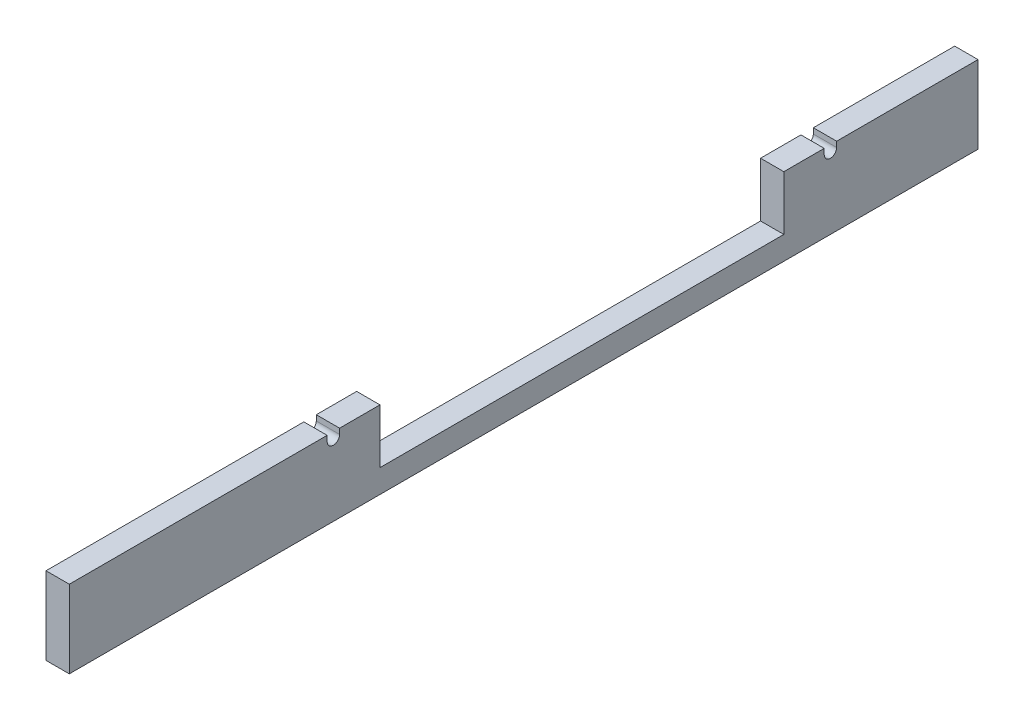
ISO-10303-21;
HEADER;
FILE_DESCRIPTION(('STEP AP214'),'2;1');
FILE_NAME('part.step','',(''),(''),'','','');
FILE_SCHEMA(('AUTOMOTIVE_DESIGN { 1 0 10303 214 1 1 1 1 }'));
ENDSEC;
DATA;
#1=APPLICATION_CONTEXT('core data for automotive mechanical design processes');
#2=APPLICATION_PROTOCOL_DEFINITION('international standard','automotive_design',2000,#1);
#3=PRODUCT_CONTEXT('',#1,'mechanical');
#4=PRODUCT('Part','Part','',(#3));
#5=PRODUCT_RELATED_PRODUCT_CATEGORY('part','',(#4));
#6=PRODUCT_DEFINITION_FORMATION('','',#4);
#7=PRODUCT_DEFINITION_CONTEXT('part definition',#1,'design');
#8=PRODUCT_DEFINITION('design','',#6,#7);
#9=PRODUCT_DEFINITION_SHAPE('','',#8);
#10=(LENGTH_UNIT() NAMED_UNIT(*) SI_UNIT(.MILLI.,.METRE.));
#11=(NAMED_UNIT(*) PLANE_ANGLE_UNIT() SI_UNIT($,.RADIAN.));
#12=(NAMED_UNIT(*) SI_UNIT($,.STERADIAN.) SOLID_ANGLE_UNIT());
#13=UNCERTAINTY_MEASURE_WITH_UNIT(LENGTH_MEASURE(1.E-05),#10,'distance_accuracy_value','');
#14=(GEOMETRIC_REPRESENTATION_CONTEXT(3) GLOBAL_UNCERTAINTY_ASSIGNED_CONTEXT((#13)) GLOBAL_UNIT_ASSIGNED_CONTEXT((#10,
#11,#12)) REPRESENTATION_CONTEXT('',''));
#15=CARTESIAN_POINT('',(0.,0.,0.));
#16=DIRECTION('',(0.,0.,1.));
#17=DIRECTION('',(1.,0.,0.));
#18=AXIS2_PLACEMENT_3D('',#15,#16,#17);
#19=CARTESIAN_POINT('',(15.,50.,0.));
#20=DIRECTION('',(0.,0.,-1.));
#21=DIRECTION('',(0.,1.,0.));
#22=AXIS2_PLACEMENT_3D('',#19,#20,#21);
#23=PLANE('',#22);
#24=DIRECTION('',(0.,-1.,0.));
#25=VECTOR('',#24,1.);
#26=CARTESIAN_POINT('',(0.,50.,0.));
#27=LINE('',#26,#25);
#28=CARTESIAN_POINT('',(0.,50.,0.));
#29=VERTEX_POINT('',#28);
#30=CARTESIAN_POINT('',(0.,0.,0.));
#31=VERTEX_POINT('',#30);
#32=EDGE_CURVE('E176',#29,#31,#27,.T.);
#33=ORIENTED_EDGE('',*,*,#32,.T.);
#34=DIRECTION('',(-1.,0.,0.));
#35=VECTOR('',#34,1.);
#36=CARTESIAN_POINT('',(15.,0.,0.));
#37=LINE('',#36,#35);
#38=CARTESIAN_POINT('',(15.,0.,0.));
#39=VERTEX_POINT('',#38);
#40=EDGE_CURVE('E11',#39,#31,#37,.T.);
#41=ORIENTED_EDGE('',*,*,#40,.F.);
#42=DIRECTION('',(0.,-1.,0.));
#43=VECTOR('',#42,1.);
#44=CARTESIAN_POINT('',(15.,50.,0.));
#45=LINE('',#44,#43);
#46=CARTESIAN_POINT('',(15.,50.,0.));
#47=VERTEX_POINT('',#46);
#48=EDGE_CURVE('E206',#47,#39,#45,.T.);
#49=ORIENTED_EDGE('',*,*,#48,.F.);
#50=DIRECTION('',(-1.,0.,0.));
#51=VECTOR('',#50,1.);
#52=CARTESIAN_POINT('',(15.,50.,0.));
#53=LINE('',#52,#51);
#54=EDGE_CURVE('E172',#47,#29,#53,.T.);
#55=ORIENTED_EDGE('',*,*,#54,.T.);
#56=EDGE_LOOP('',(#33,#41,#49,#55));
#57=FACE_BOUND('',#56,.T.);
#58=ADVANCED_FACE('F32',(#57),#23,.F.);
#59=CARTESIAN_POINT('',(15.,0.,0.));
#60=DIRECTION('',(0.,1.,0.));
#61=DIRECTION('',(0.,0.,1.));
#62=AXIS2_PLACEMENT_3D('',#59,#60,#61);
#63=PLANE('',#62);
#64=DIRECTION('',(0.,0.,-1.));
#65=VECTOR('',#64,1.);
#66=CARTESIAN_POINT('',(0.,0.,0.));
#67=LINE('',#66,#65);
#68=CARTESIAN_POINT('',(0.,0.,-585.));
#69=VERTEX_POINT('',#68);
#70=EDGE_CURVE('E179',#31,#69,#67,.T.);
#71=ORIENTED_EDGE('',*,*,#70,.T.);
#72=DIRECTION('',(-1.,0.,0.));
#73=VECTOR('',#72,1.);
#74=CARTESIAN_POINT('',(15.,0.,-585.));
#75=LINE('',#74,#73);
#76=CARTESIAN_POINT('',(15.,0.,-585.));
#77=VERTEX_POINT('',#76);
#78=EDGE_CURVE('E40',#77,#69,#75,.T.);
#79=ORIENTED_EDGE('',*,*,#78,.F.);
#80=DIRECTION('',(0.,0.,-1.));
#81=VECTOR('',#80,1.);
#82=CARTESIAN_POINT('',(15.,0.,0.));
#83=LINE('',#82,#81);
#84=EDGE_CURVE('E115',#39,#77,#83,.T.);
#85=ORIENTED_EDGE('',*,*,#84,.F.);
#86=ORIENTED_EDGE('',*,*,#40,.T.);
#87=EDGE_LOOP('',(#71,#79,#85,#86));
#88=FACE_BOUND('',#87,.T.);
#89=ADVANCED_FACE('F304',(#88),#63,.F.);
#90=CARTESIAN_POINT('',(15.,0.,-585.));
#91=DIRECTION('',(0.,0.,1.));
#92=DIRECTION('',(1.,0.,0.));
#93=AXIS2_PLACEMENT_3D('',#90,#91,#92);
#94=PLANE('',#93);
#95=DIRECTION('',(0.,1.,0.));
#96=VECTOR('',#95,1.);
#97=CARTESIAN_POINT('',(0.,0.,-585.));
#98=LINE('',#97,#96);
#99=CARTESIAN_POINT('',(0.,50.0000000000001,-585.));
#100=VERTEX_POINT('',#99);
#101=EDGE_CURVE('E181',#69,#100,#98,.T.);
#102=ORIENTED_EDGE('',*,*,#101,.T.);
#103=DIRECTION('',(-1.,0.,0.));
#104=VECTOR('',#103,1.);
#105=CARTESIAN_POINT('',(15.,50.0000000000001,-585.));
#106=LINE('',#105,#104);
#107=CARTESIAN_POINT('',(15.,50.0000000000001,-585.));
#108=VERTEX_POINT('',#107);
#109=EDGE_CURVE('E237',#108,#100,#106,.T.);
#110=ORIENTED_EDGE('',*,*,#109,.F.);
#111=DIRECTION('',(0.,1.,0.));
#112=VECTOR('',#111,1.);
#113=CARTESIAN_POINT('',(15.,0.,-585.));
#114=LINE('',#113,#112);
#115=EDGE_CURVE('E245',#77,#108,#114,.T.);
#116=ORIENTED_EDGE('',*,*,#115,.F.);
#117=ORIENTED_EDGE('',*,*,#78,.T.);
#118=EDGE_LOOP('',(#102,#110,#116,#117));
#119=FACE_BOUND('',#118,.T.);
#120=ADVANCED_FACE('F243',(#119),#94,.F.);
#121=CARTESIAN_POINT('',(15.,50.0000000000001,-585.));
#122=DIRECTION('',(0.,-1.,0.));
#123=DIRECTION('',(0.,0.,-1.));
#124=AXIS2_PLACEMENT_3D('',#121,#122,#123);
#125=PLANE('',#124);
#126=DIRECTION('',(0.,0.,1.));
#127=VECTOR('',#126,1.);
#128=CARTESIAN_POINT('',(0.,50.0000000000001,-585.));
#129=LINE('',#128,#127);
#130=CARTESIAN_POINT('',(0.,50.0000000000001,-494.));
#131=VERTEX_POINT('',#130);
#132=EDGE_CURVE('E183',#100,#131,#129,.T.);
#133=ORIENTED_EDGE('',*,*,#132,.T.);
#134=DIRECTION('',(-1.,0.,0.));
#135=VECTOR('',#134,1.);
#136=CARTESIAN_POINT('',(15.,50.0000000000001,-494.));
#137=LINE('',#136,#135);
#138=CARTESIAN_POINT('',(15.,50.0000000000001,-494.));
#139=VERTEX_POINT('',#138);
#140=EDGE_CURVE('E234',#139,#131,#137,.T.);
#141=ORIENTED_EDGE('',*,*,#140,.F.);
#142=DIRECTION('',(0.,0.,1.));
#143=VECTOR('',#142,1.);
#144=CARTESIAN_POINT('',(15.,50.0000000000001,-585.));
#145=LINE('',#144,#143);
#146=EDGE_CURVE('E263',#108,#139,#145,.T.);
#147=ORIENTED_EDGE('',*,*,#146,.F.);
#148=ORIENTED_EDGE('',*,*,#109,.T.);
#149=EDGE_LOOP('',(#133,#141,#147,#148));
#150=FACE_BOUND('',#149,.T.);
#151=ADVANCED_FACE('F254',(#150),#125,.F.);
#152=CARTESIAN_POINT('',(15.,46.5,-494.));
#153=DIRECTION('',(0.,0.,-1.));
#154=DIRECTION('',(-1.,0.,0.));
#155=AXIS2_PLACEMENT_3D('',#152,#153,#154);
#156=PLANE('',#155);
#157=DIRECTION('',(0.,-1.,0.));
#158=VECTOR('',#157,1.);
#159=CARTESIAN_POINT('',(0.,46.5,-494.));
#160=LINE('',#159,#158);
#161=CARTESIAN_POINT('',(0.,46.5,-494.));
#162=VERTEX_POINT('',#161);
#163=EDGE_CURVE('E185',#131,#162,#160,.T.);
#164=ORIENTED_EDGE('',*,*,#163,.T.);
#165=DIRECTION('',(-1.,0.,0.));
#166=VECTOR('',#165,1.);
#167=CARTESIAN_POINT('',(15.,46.5,-494.));
#168=LINE('',#167,#166);
#169=CARTESIAN_POINT('',(15.,46.5,-494.));
#170=VERTEX_POINT('',#169);
#171=EDGE_CURVE('E231',#170,#162,#168,.T.);
#172=ORIENTED_EDGE('',*,*,#171,.F.);
#173=DIRECTION('',(0.,-1.,0.));
#174=VECTOR('',#173,1.);
#175=CARTESIAN_POINT('',(15.,46.5,-494.));
#176=LINE('',#175,#174);
#177=EDGE_CURVE('E260',#139,#170,#176,.T.);
#178=ORIENTED_EDGE('',*,*,#177,.F.);
#179=ORIENTED_EDGE('',*,*,#140,.T.);
#180=EDGE_LOOP('',(#164,#172,#178,#179));
#181=FACE_BOUND('',#180,.T.);
#182=ADVANCED_FACE('F258',(#181),#156,.F.);
#183=CARTESIAN_POINT('',(15.,46.5,-490.));
#184=DIRECTION('',(-1.,0.,0.));
#185=DIRECTION('',(0.,0.,1.));
#186=AXIS2_PLACEMENT_3D('',#183,#184,#185);
#187=CYLINDRICAL_SURFACE('',#186,4.);
#188=CARTESIAN_POINT('',(0.,46.5,-490.));
#189=DIRECTION('',(-1.,0.,0.));
#190=DIRECTION('',(0.,0.,-1.));
#191=AXIS2_PLACEMENT_3D('',#188,#189,#190);
#192=CIRCLE('',#191,4.);
#193=CARTESIAN_POINT('',(0.,46.5,-486.));
#194=VERTEX_POINT('',#193);
#195=EDGE_CURVE('E187',#162,#194,#192,.T.);
#196=ORIENTED_EDGE('',*,*,#195,.T.);
#197=DIRECTION('',(-1.,0.,0.));
#198=VECTOR('',#197,1.);
#199=CARTESIAN_POINT('',(15.,46.5,-486.));
#200=LINE('',#199,#198);
#201=CARTESIAN_POINT('',(15.,46.5,-486.));
#202=VERTEX_POINT('',#201);
#203=EDGE_CURVE('E228',#202,#194,#200,.T.);
#204=ORIENTED_EDGE('',*,*,#203,.F.);
#205=CARTESIAN_POINT('',(15.,46.5,-490.));
#206=DIRECTION('',(-1.,0.,0.));
#207=DIRECTION('',(0.,0.,-1.));
#208=AXIS2_PLACEMENT_3D('',#205,#206,#207);
#209=CIRCLE('',#208,4.);
#210=EDGE_CURVE('E262',#170,#202,#209,.T.);
#211=ORIENTED_EDGE('',*,*,#210,.F.);
#212=ORIENTED_EDGE('',*,*,#171,.T.);
#213=EDGE_LOOP('',(#196,#204,#211,#212));
#214=FACE_BOUND('',#213,.T.);
#215=ADVANCED_FACE('F317',(#214),#187,.F.);
#216=CARTESIAN_POINT('',(15.,46.5,-486.));
#217=DIRECTION('',(0.,0.,1.));
#218=DIRECTION('',(1.,0.,0.));
#219=AXIS2_PLACEMENT_3D('',#216,#217,#218);
#220=PLANE('',#219);
#221=DIRECTION('',(0.,1.,0.));
#222=VECTOR('',#221,1.);
#223=CARTESIAN_POINT('',(0.,46.5,-486.));
#224=LINE('',#223,#222);
#225=CARTESIAN_POINT('',(0.,50.0000000000001,-486.));
#226=VERTEX_POINT('',#225);
#227=EDGE_CURVE('E189',#194,#226,#224,.T.);
#228=ORIENTED_EDGE('',*,*,#227,.T.);
#229=DIRECTION('',(-1.,0.,0.));
#230=VECTOR('',#229,1.);
#231=CARTESIAN_POINT('',(15.,50.0000000000001,-486.));
#232=LINE('',#231,#230);
#233=CARTESIAN_POINT('',(15.,50.0000000000001,-486.));
#234=VERTEX_POINT('',#233);
#235=EDGE_CURVE('E225',#234,#226,#232,.T.);
#236=ORIENTED_EDGE('',*,*,#235,.F.);
#237=DIRECTION('',(0.,1.,0.));
#238=VECTOR('',#237,1.);
#239=CARTESIAN_POINT('',(15.,46.5,-486.));
#240=LINE('',#239,#238);
#241=EDGE_CURVE('E265',#202,#234,#240,.T.);
#242=ORIENTED_EDGE('',*,*,#241,.F.);
#243=ORIENTED_EDGE('',*,*,#203,.T.);
#244=EDGE_LOOP('',(#228,#236,#242,#243));
#245=FACE_BOUND('',#244,.T.);
#246=ADVANCED_FACE('F320',(#245),#220,.F.);
#247=CARTESIAN_POINT('',(15.,50.0000000000001,-486.));
#248=DIRECTION('',(0.,-1.,0.));
#249=DIRECTION('',(0.,0.,-1.));
#250=AXIS2_PLACEMENT_3D('',#247,#248,#249);
#251=PLANE('',#250);
#252=DIRECTION('',(0.,0.,1.));
#253=VECTOR('',#252,1.);
#254=CARTESIAN_POINT('',(0.,50.0000000000001,-486.));
#255=LINE('',#254,#253);
#256=CARTESIAN_POINT('',(0.,50.0000000000001,-460.));
#257=VERTEX_POINT('',#256);
#258=EDGE_CURVE('E191',#226,#257,#255,.T.);
#259=ORIENTED_EDGE('',*,*,#258,.T.);
#260=DIRECTION('',(-1.,0.,0.));
#261=VECTOR('',#260,1.);
#262=CARTESIAN_POINT('',(15.,50.0000000000001,-460.));
#263=LINE('',#262,#261);
#264=CARTESIAN_POINT('',(15.,50.0000000000001,-460.));
#265=VERTEX_POINT('',#264);
#266=EDGE_CURVE('E222',#265,#257,#263,.T.);
#267=ORIENTED_EDGE('',*,*,#266,.F.);
#268=DIRECTION('',(0.,0.,1.));
#269=VECTOR('',#268,1.);
#270=CARTESIAN_POINT('',(15.,50.0000000000001,-486.));
#271=LINE('',#270,#269);
#272=EDGE_CURVE('E271',#234,#265,#271,.T.);
#273=ORIENTED_EDGE('',*,*,#272,.F.);
#274=ORIENTED_EDGE('',*,*,#235,.T.);
#275=EDGE_LOOP('',(#259,#267,#273,#274));
#276=FACE_BOUND('',#275,.T.);
#277=ADVANCED_FACE('F324',(#276),#251,.F.);
#278=CARTESIAN_POINT('',(15.,50.0000000000001,-460.));
#279=DIRECTION('',(0.,0.,-1.));
#280=DIRECTION('',(-1.,0.,0.));
#281=AXIS2_PLACEMENT_3D('',#278,#279,#280);
#282=PLANE('',#281);
#283=DIRECTION('',(0.,-1.,0.));
#284=VECTOR('',#283,1.);
#285=CARTESIAN_POINT('',(0.,50.0000000000001,-460.));
#286=LINE('',#285,#284);
#287=CARTESIAN_POINT('',(0.,15.,-460.));
#288=VERTEX_POINT('',#287);
#289=EDGE_CURVE('E193',#257,#288,#286,.T.);
#290=ORIENTED_EDGE('',*,*,#289,.T.);
#291=DIRECTION('',(-1.,0.,0.));
#292=VECTOR('',#291,1.);
#293=CARTESIAN_POINT('',(15.,15.,-460.));
#294=LINE('',#293,#292);
#295=CARTESIAN_POINT('',(15.,15.,-460.));
#296=VERTEX_POINT('',#295);
#297=EDGE_CURVE('E219',#296,#288,#294,.T.);
#298=ORIENTED_EDGE('',*,*,#297,.F.);
#299=DIRECTION('',(0.,-1.,0.));
#300=VECTOR('',#299,1.);
#301=CARTESIAN_POINT('',(15.,50.0000000000001,-460.));
#302=LINE('',#301,#300);
#303=EDGE_CURVE('E273',#265,#296,#302,.T.);
#304=ORIENTED_EDGE('',*,*,#303,.F.);
#305=ORIENTED_EDGE('',*,*,#266,.T.);
#306=EDGE_LOOP('',(#290,#298,#304,#305));
#307=FACE_BOUND('',#306,.T.);
#308=ADVANCED_FACE('F328',(#307),#282,.F.);
#309=CARTESIAN_POINT('',(15.,15.,-460.));
#310=DIRECTION('',(0.,-1.,0.));
#311=DIRECTION('',(0.,0.,-1.));
#312=AXIS2_PLACEMENT_3D('',#309,#310,#311);
#313=PLANE('',#312);
#314=DIRECTION('',(0.,0.,1.));
#315=VECTOR('',#314,1.);
#316=CARTESIAN_POINT('',(0.,15.,-460.));
#317=LINE('',#316,#315);
#318=CARTESIAN_POINT('',(0.,15.,-200.));
#319=VERTEX_POINT('',#318);
#320=EDGE_CURVE('E195',#288,#319,#317,.T.);
#321=ORIENTED_EDGE('',*,*,#320,.T.);
#322=DIRECTION('',(-1.,0.,0.));
#323=VECTOR('',#322,1.);
#324=CARTESIAN_POINT('',(15.,15.,-200.));
#325=LINE('',#324,#323);
#326=CARTESIAN_POINT('',(15.,15.,-200.));
#327=VERTEX_POINT('',#326);
#328=EDGE_CURVE('E216',#327,#319,#325,.T.);
#329=ORIENTED_EDGE('',*,*,#328,.F.);
#330=DIRECTION('',(0.,0.,1.));
#331=VECTOR('',#330,1.);
#332=CARTESIAN_POINT('',(15.,15.,-460.));
#333=LINE('',#332,#331);
#334=EDGE_CURVE('E275',#296,#327,#333,.T.);
#335=ORIENTED_EDGE('',*,*,#334,.F.);
#336=ORIENTED_EDGE('',*,*,#297,.T.);
#337=EDGE_LOOP('',(#321,#329,#335,#336));
#338=FACE_BOUND('',#337,.T.);
#339=ADVANCED_FACE('F332',(#338),#313,.F.);
#340=CARTESIAN_POINT('',(15.,15.,-200.));
#341=DIRECTION('',(0.,0.,1.));
#342=DIRECTION('',(1.,0.,0.));
#343=AXIS2_PLACEMENT_3D('',#340,#341,#342);
#344=PLANE('',#343);
#345=DIRECTION('',(0.,1.,0.));
#346=VECTOR('',#345,1.);
#347=CARTESIAN_POINT('',(0.,15.,-200.));
#348=LINE('',#347,#346);
#349=CARTESIAN_POINT('',(0.,50.,-200.));
#350=VERTEX_POINT('',#349);
#351=EDGE_CURVE('E197',#319,#350,#348,.T.);
#352=ORIENTED_EDGE('',*,*,#351,.T.);
#353=DIRECTION('',(-1.,0.,0.));
#354=VECTOR('',#353,1.);
#355=CARTESIAN_POINT('',(15.,50.,-200.));
#356=LINE('',#355,#354);
#357=CARTESIAN_POINT('',(15.,50.,-200.));
#358=VERTEX_POINT('',#357);
#359=EDGE_CURVE('E213',#358,#350,#356,.T.);
#360=ORIENTED_EDGE('',*,*,#359,.F.);
#361=DIRECTION('',(0.,1.,0.));
#362=VECTOR('',#361,1.);
#363=CARTESIAN_POINT('',(15.,15.,-200.));
#364=LINE('',#363,#362);
#365=EDGE_CURVE('E277',#327,#358,#364,.T.);
#366=ORIENTED_EDGE('',*,*,#365,.F.);
#367=ORIENTED_EDGE('',*,*,#328,.T.);
#368=EDGE_LOOP('',(#352,#360,#366,#367));
#369=FACE_BOUND('',#368,.T.);
#370=ADVANCED_FACE('F336',(#369),#344,.F.);
#371=CARTESIAN_POINT('',(15.,50.,-200.));
#372=DIRECTION('',(0.,-1.,0.));
#373=DIRECTION('',(0.,0.,-1.));
#374=AXIS2_PLACEMENT_3D('',#371,#372,#373);
#375=PLANE('',#374);
#376=DIRECTION('',(0.,0.,1.));
#377=VECTOR('',#376,1.);
#378=CARTESIAN_POINT('',(0.,50.,-200.));
#379=LINE('',#378,#377);
#380=CARTESIAN_POINT('',(0.,50.,-174.));
#381=VERTEX_POINT('',#380);
#382=EDGE_CURVE('E199',#350,#381,#379,.T.);
#383=ORIENTED_EDGE('',*,*,#382,.T.);
#384=DIRECTION('',(-1.,0.,0.));
#385=VECTOR('',#384,1.);
#386=CARTESIAN_POINT('',(15.,50.,-174.));
#387=LINE('',#386,#385);
#388=CARTESIAN_POINT('',(15.,50.,-174.));
#389=VERTEX_POINT('',#388);
#390=EDGE_CURVE('E210',#389,#381,#387,.T.);
#391=ORIENTED_EDGE('',*,*,#390,.F.);
#392=DIRECTION('',(0.,0.,1.));
#393=VECTOR('',#392,1.);
#394=CARTESIAN_POINT('',(15.,50.,-200.));
#395=LINE('',#394,#393);
#396=EDGE_CURVE('E279',#358,#389,#395,.T.);
#397=ORIENTED_EDGE('',*,*,#396,.F.);
#398=ORIENTED_EDGE('',*,*,#359,.T.);
#399=EDGE_LOOP('',(#383,#391,#397,#398));
#400=FACE_BOUND('',#399,.T.);
#401=ADVANCED_FACE('F285',(#400),#375,.F.);
#402=CARTESIAN_POINT('',(15.,46.5,-174.));
#403=DIRECTION('',(0.,0.,-1.));
#404=DIRECTION('',(-1.,0.,0.));
#405=AXIS2_PLACEMENT_3D('',#402,#403,#404);
#406=PLANE('',#405);
#407=DIRECTION('',(0.,-1.,0.));
#408=VECTOR('',#407,1.);
#409=CARTESIAN_POINT('',(0.,46.5,-174.));
#410=LINE('',#409,#408);
#411=CARTESIAN_POINT('',(0.,46.5,-174.));
#412=VERTEX_POINT('',#411);
#413=EDGE_CURVE('E201',#381,#412,#410,.T.);
#414=ORIENTED_EDGE('',*,*,#413,.T.);
#415=DIRECTION('',(-1.,0.,0.));
#416=VECTOR('',#415,1.);
#417=CARTESIAN_POINT('',(15.,46.5,-174.));
#418=LINE('',#417,#416);
#419=CARTESIAN_POINT('',(15.,46.5,-174.));
#420=VERTEX_POINT('',#419);
#421=EDGE_CURVE('E167',#420,#412,#418,.T.);
#422=ORIENTED_EDGE('',*,*,#421,.F.);
#423=DIRECTION('',(0.,-1.,0.));
#424=VECTOR('',#423,1.);
#425=CARTESIAN_POINT('',(15.,46.5,-174.));
#426=LINE('',#425,#424);
#427=EDGE_CURVE('E158',#389,#420,#426,.T.);
#428=ORIENTED_EDGE('',*,*,#427,.F.);
#429=ORIENTED_EDGE('',*,*,#390,.T.);
#430=EDGE_LOOP('',(#414,#422,#428,#429));
#431=FACE_BOUND('',#430,.T.);
#432=ADVANCED_FACE('F289',(#431),#406,.F.);
#433=CARTESIAN_POINT('',(15.,46.5,-170.));
#434=DIRECTION('',(-1.,0.,0.));
#435=DIRECTION('',(0.,0.,1.));
#436=AXIS2_PLACEMENT_3D('',#433,#434,#435);
#437=CYLINDRICAL_SURFACE('',#436,4.);
#438=CARTESIAN_POINT('',(0.,46.5,-170.));
#439=DIRECTION('',(-1.,0.,0.));
#440=DIRECTION('',(0.,0.,-1.));
#441=AXIS2_PLACEMENT_3D('',#438,#439,#440);
#442=CIRCLE('',#441,4.);
#443=CARTESIAN_POINT('',(0.,46.5,-166.));
#444=VERTEX_POINT('',#443);
#445=EDGE_CURVE('E166',#412,#444,#442,.T.);
#446=ORIENTED_EDGE('',*,*,#445,.T.);
#447=DIRECTION('',(-1.,0.,0.));
#448=VECTOR('',#447,1.);
#449=CARTESIAN_POINT('',(15.,46.5,-166.));
#450=LINE('',#449,#448);
#451=CARTESIAN_POINT('',(15.,46.5,-166.));
#452=VERTEX_POINT('',#451);
#453=EDGE_CURVE('E163',#452,#444,#450,.T.);
#454=ORIENTED_EDGE('',*,*,#453,.F.);
#455=CARTESIAN_POINT('',(15.,46.5,-170.));
#456=DIRECTION('',(-1.,0.,0.));
#457=DIRECTION('',(0.,0.,-1.));
#458=AXIS2_PLACEMENT_3D('',#455,#456,#457);
#459=CIRCLE('',#458,4.);
#460=EDGE_CURVE('E152',#420,#452,#459,.T.);
#461=ORIENTED_EDGE('',*,*,#460,.F.);
#462=ORIENTED_EDGE('',*,*,#421,.T.);
#463=EDGE_LOOP('',(#446,#454,#461,#462));
#464=FACE_BOUND('',#463,.T.);
#465=ADVANCED_FACE('F164',(#464),#437,.F.);
#466=CARTESIAN_POINT('',(15.,46.5,-166.));
#467=DIRECTION('',(0.,0.,1.));
#468=DIRECTION('',(1.,0.,0.));
#469=AXIS2_PLACEMENT_3D('',#466,#467,#468);
#470=PLANE('',#469);
#471=DIRECTION('',(0.,1.,0.));
#472=VECTOR('',#471,1.);
#473=CARTESIAN_POINT('',(0.,46.5,-166.));
#474=LINE('',#473,#472);
#475=CARTESIAN_POINT('',(0.,50.,-166.));
#476=VERTEX_POINT('',#475);
#477=EDGE_CURVE('E101',#444,#476,#474,.T.);
#478=ORIENTED_EDGE('',*,*,#477,.T.);
#479=DIRECTION('',(-1.,0.,0.));
#480=VECTOR('',#479,1.);
#481=CARTESIAN_POINT('',(15.,50.,-166.));
#482=LINE('',#481,#480);
#483=CARTESIAN_POINT('',(15.,50.,-166.));
#484=VERTEX_POINT('',#483);
#485=EDGE_CURVE('E168',#484,#476,#482,.T.);
#486=ORIENTED_EDGE('',*,*,#485,.F.);
#487=DIRECTION('',(0.,1.,0.));
#488=VECTOR('',#487,1.);
#489=CARTESIAN_POINT('',(15.,46.5,-166.));
#490=LINE('',#489,#488);
#491=EDGE_CURVE('E156',#452,#484,#490,.T.);
#492=ORIENTED_EDGE('',*,*,#491,.F.);
#493=ORIENTED_EDGE('',*,*,#453,.T.);
#494=EDGE_LOOP('',(#478,#486,#492,#493));
#495=FACE_BOUND('',#494,.T.);
#496=ADVANCED_FACE('F170',(#495),#470,.F.);
#497=CARTESIAN_POINT('',(15.,50.,-166.));
#498=DIRECTION('',(0.,-1.,0.));
#499=DIRECTION('',(0.,0.,-1.));
#500=AXIS2_PLACEMENT_3D('',#497,#498,#499);
#501=PLANE('',#500);
#502=DIRECTION('',(0.,0.,1.));
#503=VECTOR('',#502,1.);
#504=CARTESIAN_POINT('',(0.,50.,-166.));
#505=LINE('',#504,#503);
#506=EDGE_CURVE('E107',#476,#29,#505,.T.);
#507=ORIENTED_EDGE('',*,*,#506,.T.);
#508=ORIENTED_EDGE('',*,*,#54,.F.);
#509=DIRECTION('',(0.,0.,1.));
#510=VECTOR('',#509,1.);
#511=CARTESIAN_POINT('',(15.,50.,-166.));
#512=LINE('',#511,#510);
#513=EDGE_CURVE('E48',#484,#47,#512,.T.);
#514=ORIENTED_EDGE('',*,*,#513,.F.);
#515=ORIENTED_EDGE('',*,*,#485,.T.);
#516=EDGE_LOOP('',(#507,#508,#514,#515));
#517=FACE_BOUND('',#516,.T.);
#518=ADVANCED_FACE('F293',(#517),#501,.F.);
#519=CARTESIAN_POINT('',(15.,46.5,-490.));
#520=DIRECTION('',(1.,0.,0.));
#521=DIRECTION('',(0.,0.,-1.));
#522=AXIS2_PLACEMENT_3D('',#519,#520,#521);
#523=PLANE('',#522);
#524=ORIENTED_EDGE('',*,*,#48,.T.);
#525=ORIENTED_EDGE('',*,*,#84,.T.);
#526=ORIENTED_EDGE('',*,*,#115,.T.);
#527=ORIENTED_EDGE('',*,*,#146,.T.);
#528=ORIENTED_EDGE('',*,*,#177,.T.);
#529=ORIENTED_EDGE('',*,*,#210,.T.);
#530=ORIENTED_EDGE('',*,*,#241,.T.);
#531=ORIENTED_EDGE('',*,*,#272,.T.);
#532=ORIENTED_EDGE('',*,*,#303,.T.);
#533=ORIENTED_EDGE('',*,*,#334,.T.);
#534=ORIENTED_EDGE('',*,*,#365,.T.);
#535=ORIENTED_EDGE('',*,*,#396,.T.);
#536=ORIENTED_EDGE('',*,*,#427,.T.);
#537=ORIENTED_EDGE('',*,*,#460,.T.);
#538=ORIENTED_EDGE('',*,*,#491,.T.);
#539=ORIENTED_EDGE('',*,*,#513,.T.);
#540=EDGE_LOOP('',(#524,#525,#526,#527,#528,#529,#530,#531,#532,#533,#534,#535,#536,#537,#538,#539));
#541=FACE_BOUND('',#540,.T.);
#542=ADVANCED_FACE('F154',(#541),#523,.T.);
#543=CARTESIAN_POINT('',(0.,46.5,-490.));
#544=DIRECTION('',(1.,0.,0.));
#545=DIRECTION('',(0.,0.,-1.));
#546=AXIS2_PLACEMENT_3D('',#543,#544,#545);
#547=PLANE('',#546);
#548=ORIENTED_EDGE('',*,*,#32,.F.);
#549=ORIENTED_EDGE('',*,*,#506,.F.);
#550=ORIENTED_EDGE('',*,*,#477,.F.);
#551=ORIENTED_EDGE('',*,*,#445,.F.);
#552=ORIENTED_EDGE('',*,*,#413,.F.);
#553=ORIENTED_EDGE('',*,*,#382,.F.);
#554=ORIENTED_EDGE('',*,*,#351,.F.);
#555=ORIENTED_EDGE('',*,*,#320,.F.);
#556=ORIENTED_EDGE('',*,*,#289,.F.);
#557=ORIENTED_EDGE('',*,*,#258,.F.);
#558=ORIENTED_EDGE('',*,*,#227,.F.);
#559=ORIENTED_EDGE('',*,*,#195,.F.);
#560=ORIENTED_EDGE('',*,*,#163,.F.);
#561=ORIENTED_EDGE('',*,*,#132,.F.);
#562=ORIENTED_EDGE('',*,*,#101,.F.);
#563=ORIENTED_EDGE('',*,*,#70,.F.);
#564=EDGE_LOOP('',(#548,#549,#550,#551,#552,#553,#554,#555,#556,#557,#558,#559,#560,#561,#562,#563));
#565=FACE_BOUND('',#564,.T.);
#566=ADVANCED_FACE('F249',(#565),#547,.F.);
#567=CLOSED_SHELL('',(#58,#89,#120,#151,#182,#215,#246,#277,#308,#339,#370,#401,#432,#465,#496,
#518,#542,#566));
#568=MANIFOLD_SOLID_BREP('B2',#567);
#569=ADVANCED_BREP_SHAPE_REPRESENTATION('',(#18,#568),#14);
#570=SHAPE_DEFINITION_REPRESENTATION(#9,#569);
ENDSEC;
END-ISO-10303-21;
